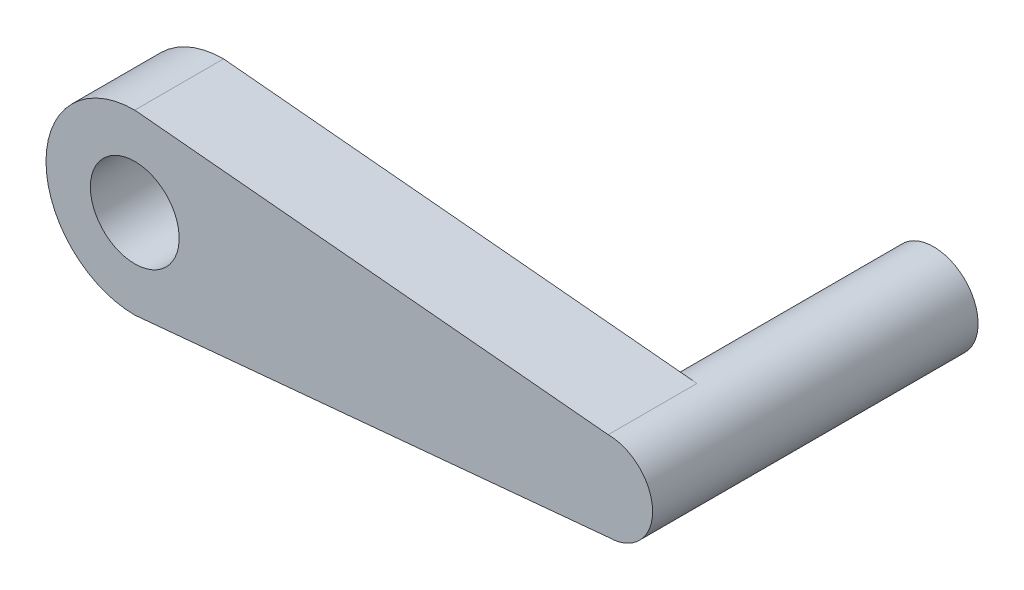
ISO-10303-21;
HEADER;
FILE_DESCRIPTION(('STEP AP214'),'2;1');
FILE_NAME('part.step','',(''),(''),'','','');
FILE_SCHEMA(('AUTOMOTIVE_DESIGN { 1 0 10303 214 1 1 1 1 }'));
ENDSEC;
DATA;
#1=APPLICATION_CONTEXT('core data for automotive mechanical design processes');
#2=APPLICATION_PROTOCOL_DEFINITION('international standard','automotive_design',2000,#1);
#3=PRODUCT_CONTEXT('',#1,'mechanical');
#4=PRODUCT('Part','Part','',(#3));
#5=PRODUCT_RELATED_PRODUCT_CATEGORY('part','',(#4));
#6=PRODUCT_DEFINITION_FORMATION('','',#4);
#7=PRODUCT_DEFINITION_CONTEXT('part definition',#1,'design');
#8=PRODUCT_DEFINITION('design','',#6,#7);
#9=PRODUCT_DEFINITION_SHAPE('','',#8);
#10=(LENGTH_UNIT() NAMED_UNIT(*) SI_UNIT(.MILLI.,.METRE.));
#11=(NAMED_UNIT(*) PLANE_ANGLE_UNIT() SI_UNIT($,.RADIAN.));
#12=(NAMED_UNIT(*) SI_UNIT($,.STERADIAN.) SOLID_ANGLE_UNIT());
#13=UNCERTAINTY_MEASURE_WITH_UNIT(LENGTH_MEASURE(1.E-05),#10,'distance_accuracy_value','');
#14=(GEOMETRIC_REPRESENTATION_CONTEXT(3) GLOBAL_UNCERTAINTY_ASSIGNED_CONTEXT((#13)) GLOBAL_UNIT_ASSIGNED_CONTEXT((#10,
#11,#12)) REPRESENTATION_CONTEXT('',''));
#15=CARTESIAN_POINT('',(0.,0.,0.));
#16=DIRECTION('',(0.,0.,1.));
#17=DIRECTION('',(1.,0.,0.));
#18=AXIS2_PLACEMENT_3D('',#15,#16,#17);
#19=CARTESIAN_POINT('',(0.885188770571152,-9.44201355275895,9.525));
#20=DIRECTION('',(-0.0933407086930583,0.995634226059288,0.));
#21=DIRECTION('',(-0.995634226059288,-0.0933407086930583,0.));
#22=AXIS2_PLACEMENT_3D('',#19,#20,#21);
#23=PLANE('',#22);
#24=DIRECTION('',(0.995634226059288,0.0933407086930583,0.));
#25=VECTOR('',#24,1.);
#26=CARTESIAN_POINT('',(0.885188770571152,-9.44201355275895,0.));
#27=LINE('',#26,#25);
#28=CARTESIAN_POINT('',(0.,-9.525,0.));
#29=VERTEX_POINT('',#28);
#30=CARTESIAN_POINT('',(50.8,-4.7625,0.));
#31=VERTEX_POINT('',#30);
#32=EDGE_CURVE('E100',#29,#31,#27,.T.);
#33=ORIENTED_EDGE('',*,*,#32,.T.);
#34=DIRECTION('',(0.,0.,-1.));
#35=VECTOR('',#34,1.);
#36=CARTESIAN_POINT('',(50.8,-4.7625,9.525));
#37=LINE('',#36,#35);
#38=CARTESIAN_POINT('',(50.8,-4.7625,9.525));
#39=VERTEX_POINT('',#38);
#40=EDGE_CURVE('E49',#39,#31,#37,.T.);
#41=ORIENTED_EDGE('',*,*,#40,.F.);
#42=DIRECTION('',(0.995634226059288,0.0933407086930583,0.));
#43=VECTOR('',#42,1.);
#44=CARTESIAN_POINT('',(0.885188770571152,-9.44201355275895,9.525));
#45=LINE('',#44,#43);
#46=CARTESIAN_POINT('',(0.,-9.525,9.525));
#47=VERTEX_POINT('',#46);
#48=EDGE_CURVE('E138',#47,#39,#45,.T.);
#49=ORIENTED_EDGE('',*,*,#48,.F.);
#50=DIRECTION('',(0.,0.,-1.));
#51=VECTOR('',#50,1.);
#52=CARTESIAN_POINT('',(0.,-9.525,9.525));
#53=LINE('',#52,#51);
#54=EDGE_CURVE('E115',#47,#29,#53,.T.);
#55=ORIENTED_EDGE('',*,*,#54,.T.);
#56=EDGE_LOOP('',(#33,#41,#49,#55));
#57=FACE_BOUND('',#56,.T.);
#58=ADVANCED_FACE('F45',(#57),#23,.F.);
#59=CARTESIAN_POINT('',(50.8,0.,9.525));
#60=DIRECTION('',(0.,0.,-1.));
#61=DIRECTION('',(-1.,0.,0.));
#62=AXIS2_PLACEMENT_3D('',#59,#60,#61);
#63=CYLINDRICAL_SURFACE('',#62,4.7625);
#64=ORIENTED_EDGE('',*,*,#40,.T.);
#65=CARTESIAN_POINT('',(50.8,0.,0.));
#66=DIRECTION('',(0.,0.,-1.));
#67=DIRECTION('',(-1.,0.,0.));
#68=AXIS2_PLACEMENT_3D('',#65,#66,#67);
#69=CIRCLE('',#68,4.7625);
#70=CARTESIAN_POINT('',(50.7999999999999,4.7625,0.));
#71=VERTEX_POINT('',#70);
#72=EDGE_CURVE('E11',#31,#71,#69,.T.);
#73=ORIENTED_EDGE('',*,*,#72,.T.);
#74=DIRECTION('',(0.,0.,-1.));
#75=VECTOR('',#74,1.);
#76=CARTESIAN_POINT('',(50.8,4.7625,9.525));
#77=LINE('',#76,#75);
#78=CARTESIAN_POINT('',(50.8,4.7625,9.525));
#79=VERTEX_POINT('',#78);
#80=EDGE_CURVE('E103',#79,#71,#77,.T.);
#81=ORIENTED_EDGE('',*,*,#80,.F.);
#82=CARTESIAN_POINT('',(50.8,0.,9.525));
#83=DIRECTION('',(0.,0.,1.));
#84=DIRECTION('',(1.,0.,0.));
#85=AXIS2_PLACEMENT_3D('',#82,#83,#84);
#86=CIRCLE('',#85,4.7625);
#87=EDGE_CURVE('E93',#39,#79,#86,.T.);
#88=ORIENTED_EDGE('',*,*,#87,.F.);
#89=EDGE_LOOP('',(#64,#73,#81,#88));
#90=FACE_BOUND('',#89,.T.);
#91=CARTESIAN_POINT('',(50.8,0.,-25.4));
#92=DIRECTION('',(0.,0.,-1.));
#93=DIRECTION('',(-1.,0.,0.));
#94=AXIS2_PLACEMENT_3D('',#91,#92,#93);
#95=CIRCLE('',#94,4.7625);
#96=CARTESIAN_POINT('',(46.0375,0.,-25.4));
#97=VERTEX_POINT('',#96);
#98=EDGE_CURVE('E121',#97,#97,#95,.T.);
#99=ORIENTED_EDGE('',*,*,#98,.F.);
#100=EDGE_LOOP('',(#99));
#101=FACE_BOUND('',#100,.T.);
#102=ADVANCED_FACE('F108',(#90,#101),#63,.T.);
#103=CARTESIAN_POINT('',(0.885188770571152,9.44201355275895,9.525));
#104=DIRECTION('',(-0.0933407086930583,-0.995634226059288,0.));
#105=DIRECTION('',(0.995634226059288,-0.0933407086930583,0.));
#106=AXIS2_PLACEMENT_3D('',#103,#104,#105);
#107=PLANE('',#106);
#108=DIRECTION('',(-0.995634226059288,0.0933407086930583,0.));
#109=VECTOR('',#108,1.);
#110=CARTESIAN_POINT('',(0.885188770571152,9.44201355275895,0.));
#111=LINE('',#110,#109);
#112=CARTESIAN_POINT('',(0.,9.525,0.));
#113=VERTEX_POINT('',#112);
#114=EDGE_CURVE('E79',#71,#113,#111,.T.);
#115=ORIENTED_EDGE('',*,*,#114,.T.);
#116=DIRECTION('',(0.,0.,-1.));
#117=VECTOR('',#116,1.);
#118=CARTESIAN_POINT('',(0.,9.525,9.525));
#119=LINE('',#118,#117);
#120=CARTESIAN_POINT('',(0.,9.525,9.525));
#121=VERTEX_POINT('',#120);
#122=EDGE_CURVE('E107',#121,#113,#119,.T.);
#123=ORIENTED_EDGE('',*,*,#122,.F.);
#124=DIRECTION('',(-0.995634226059288,0.0933407086930583,0.));
#125=VECTOR('',#124,1.);
#126=CARTESIAN_POINT('',(0.885188770571152,9.44201355275895,9.525));
#127=LINE('',#126,#125);
#128=EDGE_CURVE('E105',#79,#121,#127,.T.);
#129=ORIENTED_EDGE('',*,*,#128,.F.);
#130=ORIENTED_EDGE('',*,*,#80,.T.);
#131=EDGE_LOOP('',(#115,#123,#129,#130));
#132=FACE_BOUND('',#131,.T.);
#133=ADVANCED_FACE('F104',(#132),#107,.F.);
#134=CARTESIAN_POINT('',(0.,0.,9.525));
#135=DIRECTION('',(0.,0.,-1.));
#136=DIRECTION('',(-1.,0.,0.));
#137=AXIS2_PLACEMENT_3D('',#134,#135,#136);
#138=CYLINDRICAL_SURFACE('',#137,4.7625);
#139=CARTESIAN_POINT('',(0.,0.,9.525));
#140=DIRECTION('',(0.,0.,1.));
#141=DIRECTION('',(1.,0.,0.));
#142=AXIS2_PLACEMENT_3D('',#139,#140,#141);
#143=CIRCLE('',#142,4.7625);
#144=CARTESIAN_POINT('',(-4.7625,0.,9.525));
#145=VERTEX_POINT('',#144);
#146=EDGE_CURVE('E127',#145,#145,#143,.T.);
#147=CARTESIAN_POINT('',(0.,0.,0.));
#148=DIRECTION('',(0.,0.,1.));
#149=DIRECTION('',(1.,0.,0.));
#150=AXIS2_PLACEMENT_3D('',#147,#148,#149);
#151=CIRCLE('',#150,4.7625);
#152=CARTESIAN_POINT('',(-4.7625,0.,0.));
#153=VERTEX_POINT('',#152);
#154=EDGE_CURVE('E117',#153,#153,#151,.T.);
#155=CARTESIAN_POINT('',(-4.7625,0.,9.525));
#156=CARTESIAN_POINT('',(-4.7625,0.,9.42578125));
#157=CARTESIAN_POINT('',(-4.7625,0.,9.3265625));
#158=CARTESIAN_POINT('',(-4.7625,0.,9.128125));
#159=CARTESIAN_POINT('',(-4.7625,0.,9.02890625));
#160=CARTESIAN_POINT('',(-4.7625,0.,8.83046875));
#161=CARTESIAN_POINT('',(-4.7625,0.,8.73125));
#162=CARTESIAN_POINT('',(-4.7625,0.,8.5328125));
#163=CARTESIAN_POINT('',(-4.7625,0.,8.43359375));
#164=CARTESIAN_POINT('',(-4.7625,0.,8.23515625));
#165=CARTESIAN_POINT('',(-4.7625,0.,8.1359375));
#166=CARTESIAN_POINT('',(-4.7625,0.,7.9375));
#167=CARTESIAN_POINT('',(-4.7625,0.,7.83828125));
#168=CARTESIAN_POINT('',(-4.7625,0.,7.63984375));
#169=CARTESIAN_POINT('',(-4.7625,0.,7.540625));
#170=CARTESIAN_POINT('',(-4.7625,0.,7.3421875));
#171=CARTESIAN_POINT('',(-4.7625,0.,7.24296875));
#172=CARTESIAN_POINT('',(-4.7625,0.,7.04453125));
#173=CARTESIAN_POINT('',(-4.7625,0.,6.9453125));
#174=CARTESIAN_POINT('',(-4.7625,0.,6.746875));
#175=CARTESIAN_POINT('',(-4.7625,0.,6.64765625));
#176=CARTESIAN_POINT('',(-4.7625,0.,6.44921875));
#177=CARTESIAN_POINT('',(-4.7625,0.,6.35));
#178=CARTESIAN_POINT('',(-4.7625,0.,6.1515625));
#179=CARTESIAN_POINT('',(-4.7625,0.,6.05234375));
#180=CARTESIAN_POINT('',(-4.7625,0.,5.85390625));
#181=CARTESIAN_POINT('',(-4.7625,0.,5.7546875));
#182=CARTESIAN_POINT('',(-4.7625,0.,5.55625));
#183=CARTESIAN_POINT('',(-4.7625,0.,5.45703125));
#184=CARTESIAN_POINT('',(-4.7625,0.,5.25859375));
#185=CARTESIAN_POINT('',(-4.7625,0.,5.159375));
#186=CARTESIAN_POINT('',(-4.7625,0.,4.9609375));
#187=CARTESIAN_POINT('',(-4.7625,0.,4.86171875));
#188=CARTESIAN_POINT('',(-4.7625,0.,4.66328125));
#189=CARTESIAN_POINT('',(-4.7625,0.,4.5640625));
#190=CARTESIAN_POINT('',(-4.7625,0.,4.365625));
#191=CARTESIAN_POINT('',(-4.7625,0.,4.26640625));
#192=CARTESIAN_POINT('',(-4.7625,0.,4.06796875));
#193=CARTESIAN_POINT('',(-4.7625,0.,3.96875));
#194=CARTESIAN_POINT('',(-4.7625,0.,3.7703125));
#195=CARTESIAN_POINT('',(-4.7625,0.,3.67109375));
#196=CARTESIAN_POINT('',(-4.7625,0.,3.47265625));
#197=CARTESIAN_POINT('',(-4.7625,0.,3.3734375));
#198=CARTESIAN_POINT('',(-4.7625,0.,3.175));
#199=CARTESIAN_POINT('',(-4.7625,0.,3.07578125));
#200=CARTESIAN_POINT('',(-4.7625,0.,2.87734375));
#201=CARTESIAN_POINT('',(-4.7625,0.,2.778125));
#202=CARTESIAN_POINT('',(-4.7625,0.,2.5796875));
#203=CARTESIAN_POINT('',(-4.7625,0.,2.48046875));
#204=CARTESIAN_POINT('',(-4.7625,0.,2.28203125));
#205=CARTESIAN_POINT('',(-4.7625,0.,2.1828125));
#206=CARTESIAN_POINT('',(-4.7625,0.,1.984375));
#207=CARTESIAN_POINT('',(-4.7625,0.,1.88515625));
#208=CARTESIAN_POINT('',(-4.7625,0.,1.68671875));
#209=CARTESIAN_POINT('',(-4.7625,0.,1.5875));
#210=CARTESIAN_POINT('',(-4.7625,0.,1.3890625));
#211=CARTESIAN_POINT('',(-4.7625,0.,1.28984375));
#212=CARTESIAN_POINT('',(-4.7625,0.,1.09140625));
#213=CARTESIAN_POINT('',(-4.7625,0.,0.992187500000001));
#214=CARTESIAN_POINT('',(-4.7625,0.,0.793750000000001));
#215=CARTESIAN_POINT('',(-4.7625,0.,0.69453125));
#216=CARTESIAN_POINT('',(-4.7625,0.,0.49609375));
#217=CARTESIAN_POINT('',(-4.7625,0.,0.396875));
#218=CARTESIAN_POINT('',(-4.7625,0.,0.1984375));
#219=CARTESIAN_POINT('',(-4.7625,0.,0.0992187500000001));
#220=CARTESIAN_POINT('',(-4.7625,0.,0.));
#221=B_SPLINE_CURVE_WITH_KNOTS('',3,(#155,#156,#157,#158,#159,#160,#161,#162,#163,#164,#165,
#166,#167,#168,#169,#170,#171,#172,#173,#174,#175,#176,#177,#178,#179,#180,#181,#182,#183,#184,
#185,#186,#187,#188,#189,#190,#191,#192,#193,#194,#195,#196,#197,#198,#199,#200,#201,#202,#203,
#204,#205,#206,#207,#208,#209,#210,#211,#212,#213,#214,#215,#216,#217,#218,#219,#220),
.UNSPECIFIED.,.F.,.F.,(4,2,2,2,2,2,2,2,2,2,2,2,2,2,2,2,2,2,2,2,2,2,2,2,2,2,2,2,2,2,2,2,4),(0.,
0.29765625,0.5953125,0.892968750000001,1.190625,1.48828125,1.7859375,2.08359375,2.38125,
2.67890625,2.9765625,3.27421875,3.571875,3.86953125,4.1671875,4.46484375,4.7625,5.06015625,
5.3578125,5.65546875,5.953125,6.25078125,6.5484375,6.84609375,7.14375,7.44140625,7.7390625,
8.03671875,8.334375,8.63203125,8.9296875,9.22734375,9.525),.UNSPECIFIED.);
#222=EDGE_CURVE('BSEAM47',#145,#153,#221,.T.);
#223=ORIENTED_EDGE('',*,*,#146,.T.);
#224=ORIENTED_EDGE('',*,*,#154,.F.);
#225=ORIENTED_EDGE('',*,*,#222,.T.);
#226=ORIENTED_EDGE('',*,*,#222,.F.);
#227=EDGE_LOOP('',(#223,#225,#224,#226));
#228=FACE_BOUND('',#227,.T.);
#229=ADVANCED_FACE('F47',(#228),#138,.F.);
#230=CARTESIAN_POINT('',(0.,0.,9.525));
#231=DIRECTION('',(0.,0.,-1.));
#232=DIRECTION('',(-1.,0.,0.));
#233=AXIS2_PLACEMENT_3D('',#230,#231,#232);
#234=CYLINDRICAL_SURFACE('',#233,9.525);
#235=CARTESIAN_POINT('',(0.,0.,0.));
#236=DIRECTION('',(0.,0.,1.));
#237=DIRECTION('',(1.,0.,0.));
#238=AXIS2_PLACEMENT_3D('',#235,#236,#237);
#239=CIRCLE('',#238,9.525);
#240=EDGE_CURVE('E85',#113,#29,#239,.T.);
#241=ORIENTED_EDGE('',*,*,#240,.T.);
#242=ORIENTED_EDGE('',*,*,#54,.F.);
#243=CARTESIAN_POINT('',(0.,0.,9.525));
#244=DIRECTION('',(0.,0.,1.));
#245=DIRECTION('',(1.,0.,0.));
#246=AXIS2_PLACEMENT_3D('',#243,#244,#245);
#247=CIRCLE('',#246,9.525);
#248=EDGE_CURVE('E64',#121,#47,#247,.T.);
#249=ORIENTED_EDGE('',*,*,#248,.F.);
#250=ORIENTED_EDGE('',*,*,#122,.T.);
#251=EDGE_LOOP('',(#241,#242,#249,#250));
#252=FACE_BOUND('',#251,.T.);
#253=ADVANCED_FACE('F131',(#252),#234,.T.);
#254=CARTESIAN_POINT('',(0.,0.,9.525));
#255=DIRECTION('',(0.,0.,1.));
#256=DIRECTION('',(1.,0.,0.));
#257=AXIS2_PLACEMENT_3D('',#254,#255,#256);
#258=PLANE('',#257);
#259=ORIENTED_EDGE('',*,*,#146,.F.);
#260=EDGE_LOOP('',(#259));
#261=FACE_BOUND('',#260,.T.);
#262=ORIENTED_EDGE('',*,*,#48,.T.);
#263=ORIENTED_EDGE('',*,*,#87,.T.);
#264=ORIENTED_EDGE('',*,*,#128,.T.);
#265=ORIENTED_EDGE('',*,*,#248,.T.);
#266=EDGE_LOOP('',(#262,#263,#264,#265));
#267=FACE_BOUND('',#266,.T.);
#268=ADVANCED_FACE('F160',(#261,#267),#258,.T.);
#269=CARTESIAN_POINT('',(0.,0.,0.));
#270=DIRECTION('',(0.,0.,1.));
#271=DIRECTION('',(1.,0.,0.));
#272=AXIS2_PLACEMENT_3D('',#269,#270,#271);
#273=PLANE('',#272);
#274=ORIENTED_EDGE('',*,*,#72,.F.);
#275=ORIENTED_EDGE('',*,*,#32,.F.);
#276=ORIENTED_EDGE('',*,*,#240,.F.);
#277=ORIENTED_EDGE('',*,*,#114,.F.);
#278=EDGE_LOOP('',(#274,#275,#276,#277));
#279=FACE_BOUND('',#278,.T.);
#280=ORIENTED_EDGE('',*,*,#154,.T.);
#281=EDGE_LOOP('',(#280));
#282=FACE_BOUND('',#281,.T.);
#283=ADVANCED_FACE('F96',(#279,#282),#273,.F.);
#284=CARTESIAN_POINT('',(50.8,0.,-25.4));
#285=DIRECTION('',(0.,0.,-1.));
#286=DIRECTION('',(-1.,0.,0.));
#287=AXIS2_PLACEMENT_3D('',#284,#285,#286);
#288=PLANE('',#287);
#289=ORIENTED_EDGE('',*,*,#98,.T.);
#290=EDGE_LOOP('',(#289));
#291=FACE_BOUND('',#290,.T.);
#292=ADVANCED_FACE('F148',(#291),#288,.T.);
#293=CLOSED_SHELL('',(#58,#102,#133,#229,#253,#268,#283,#292));
#294=MANIFOLD_SOLID_BREP('B2',#293);
#295=ADVANCED_BREP_SHAPE_REPRESENTATION('',(#18,#294),#14);
#296=SHAPE_DEFINITION_REPRESENTATION(#9,#295);
ENDSEC;
END-ISO-10303-21;
